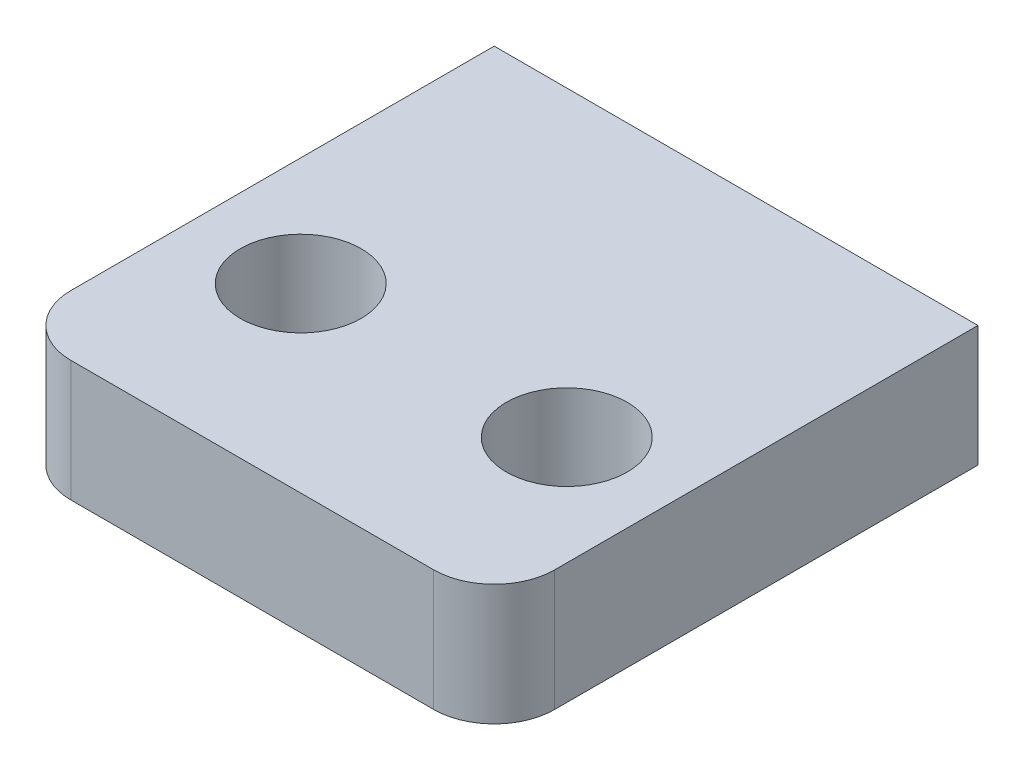
ISO-10303-21;
HEADER;
FILE_DESCRIPTION(('STEP AP214'),'2;1');
FILE_NAME('part.step','',(''),(''),'','','');
FILE_SCHEMA(('AUTOMOTIVE_DESIGN { 1 0 10303 214 1 1 1 1 }'));
ENDSEC;
DATA;
#1=APPLICATION_CONTEXT('core data for automotive mechanical design processes');
#2=APPLICATION_PROTOCOL_DEFINITION('international standard','automotive_design',2000,#1);
#3=PRODUCT_CONTEXT('',#1,'mechanical');
#4=PRODUCT('Part','Part','',(#3));
#5=PRODUCT_RELATED_PRODUCT_CATEGORY('part','',(#4));
#6=PRODUCT_DEFINITION_FORMATION('','',#4);
#7=PRODUCT_DEFINITION_CONTEXT('part definition',#1,'design');
#8=PRODUCT_DEFINITION('design','',#6,#7);
#9=PRODUCT_DEFINITION_SHAPE('','',#8);
#10=(LENGTH_UNIT() NAMED_UNIT(*) SI_UNIT(.MILLI.,.METRE.));
#11=(NAMED_UNIT(*) PLANE_ANGLE_UNIT() SI_UNIT($,.RADIAN.));
#12=(NAMED_UNIT(*) SI_UNIT($,.STERADIAN.) SOLID_ANGLE_UNIT());
#13=UNCERTAINTY_MEASURE_WITH_UNIT(LENGTH_MEASURE(1.E-05),#10,'distance_accuracy_value','');
#14=(GEOMETRIC_REPRESENTATION_CONTEXT(3) GLOBAL_UNCERTAINTY_ASSIGNED_CONTEXT((#13)) GLOBAL_UNIT_ASSIGNED_CONTEXT((#10,
#11,#12)) REPRESENTATION_CONTEXT('',''));
#15=CARTESIAN_POINT('',(0.,0.,0.));
#16=DIRECTION('',(0.,0.,1.));
#17=DIRECTION('',(1.,0.,0.));
#18=AXIS2_PLACEMENT_3D('',#15,#16,#17);
#19=CARTESIAN_POINT('',(0.,20.,0.));
#20=DIRECTION('',(0.,1.,0.));
#21=DIRECTION('',(0.,0.,1.));
#22=AXIS2_PLACEMENT_3D('',#19,#20,#21);
#23=PLANE('',#22);
#24=CARTESIAN_POINT('',(-2.62395543175487,20.,10.7799442896936));
#25=DIRECTION('',(0.,-1.,0.));
#26=DIRECTION('',(0.,0.,-1.));
#27=AXIS2_PLACEMENT_3D('',#24,#25,#26);
#28=CIRCLE('',#27,10.);
#29=CARTESIAN_POINT('',(-2.62395543175487,20.,0.779944289693604));
#30=VERTEX_POINT('',#29);
#31=EDGE_CURVE('E180',#30,#30,#28,.T.);
#32=ORIENTED_EDGE('',*,*,#31,.T.);
#33=EDGE_LOOP('',(#32));
#34=FACE_BOUND('',#33,.T.);
#35=DIRECTION('',(0.,0.,1.));
#36=VECTOR('',#35,1.);
#37=CARTESIAN_POINT('',(-64.6239554317549,20.,-39.2200557103064));
#38=LINE('',#37,#36);
#39=CARTESIAN_POINT('',(-64.6239554317549,20.,-39.2200557103064));
#40=VERTEX_POINT('',#39);
#41=CARTESIAN_POINT('',(-64.6239554317549,20.,30.7799442896936));
#42=VERTEX_POINT('',#41);
#43=EDGE_CURVE('E125',#40,#42,#38,.T.);
#44=ORIENTED_EDGE('',*,*,#43,.T.);
#45=CARTESIAN_POINT('',(-54.6239554317549,20.,30.7799442896936));
#46=DIRECTION('',(0.,1.,0.));
#47=DIRECTION('',(0.,0.,1.));
#48=AXIS2_PLACEMENT_3D('',#45,#46,#47);
#49=CIRCLE('',#48,10.);
#50=CARTESIAN_POINT('',(-54.6239554317549,20.,40.7799442896936));
#51=VERTEX_POINT('',#50);
#52=EDGE_CURVE('E11',#42,#51,#49,.T.);
#53=ORIENTED_EDGE('',*,*,#52,.T.);
#54=DIRECTION('',(1.,0.,0.));
#55=VECTOR('',#54,1.);
#56=CARTESIAN_POINT('',(-64.6239554317549,20.,40.7799442896936));
#57=LINE('',#56,#55);
#58=CARTESIAN_POINT('',(5.37604456824514,20.,40.7799442896936));
#59=VERTEX_POINT('',#58);
#60=EDGE_CURVE('E100',#51,#59,#57,.T.);
#61=ORIENTED_EDGE('',*,*,#60,.T.);
#62=CARTESIAN_POINT('',(5.37604456824514,20.,30.7799442896936));
#63=DIRECTION('',(0.,1.,0.));
#64=DIRECTION('',(0.,0.,1.));
#65=AXIS2_PLACEMENT_3D('',#62,#63,#64);
#66=CIRCLE('',#65,10.);
#67=CARTESIAN_POINT('',(15.3760445682451,20.,30.7799442896936));
#68=VERTEX_POINT('',#67);
#69=EDGE_CURVE('E96',#59,#68,#66,.T.);
#70=ORIENTED_EDGE('',*,*,#69,.T.);
#71=DIRECTION('',(0.,0.,-1.));
#72=VECTOR('',#71,1.);
#73=CARTESIAN_POINT('',(15.3760445682451,20.,-39.2200557103064));
#74=LINE('',#73,#72);
#75=CARTESIAN_POINT('',(15.3760445682451,20.,-39.2200557103064));
#76=VERTEX_POINT('',#75);
#77=EDGE_CURVE('E89',#68,#76,#74,.T.);
#78=ORIENTED_EDGE('',*,*,#77,.T.);
#79=DIRECTION('',(-1.,0.,0.));
#80=VECTOR('',#79,1.);
#81=CARTESIAN_POINT('',(-64.6239554317549,20.,-39.2200557103064));
#82=LINE('',#81,#80);
#83=EDGE_CURVE('E93',#76,#40,#82,.T.);
#84=ORIENTED_EDGE('',*,*,#83,.T.);
#85=EDGE_LOOP('',(#44,#53,#61,#70,#78,#84));
#86=FACE_BOUND('',#85,.T.);
#87=CARTESIAN_POINT('',(-46.6239554317549,20.,10.7799442896936));
#88=DIRECTION('',(0.,1.,0.));
#89=DIRECTION('',(0.,0.,1.));
#90=AXIS2_PLACEMENT_3D('',#87,#88,#89);
#91=CIRCLE('',#90,10.);
#92=CARTESIAN_POINT('',(-46.6239554317549,20.,20.7799442896936));
#93=VERTEX_POINT('',#92);
#94=EDGE_CURVE('E182',#93,#93,#91,.T.);
#95=ORIENTED_EDGE('',*,*,#94,.F.);
#96=EDGE_LOOP('',(#95));
#97=FACE_BOUND('',#96,.T.);
#98=ADVANCED_FACE('F37',(#34,#86,#97),#23,.T.);
#99=CARTESIAN_POINT('',(0.,0.,0.));
#100=DIRECTION('',(0.,1.,0.));
#101=DIRECTION('',(0.,0.,1.));
#102=AXIS2_PLACEMENT_3D('',#99,#100,#101);
#103=PLANE('',#102);
#104=DIRECTION('',(1.,0.,0.));
#105=VECTOR('',#104,1.);
#106=CARTESIAN_POINT('',(-64.6239554317549,0.,40.7799442896936));
#107=LINE('',#106,#105);
#108=CARTESIAN_POINT('',(-54.6239554317549,0.,40.7799442896936));
#109=VERTEX_POINT('',#108);
#110=CARTESIAN_POINT('',(5.37604456824514,0.,40.7799442896936));
#111=VERTEX_POINT('',#110);
#112=EDGE_CURVE('E120',#109,#111,#107,.T.);
#113=ORIENTED_EDGE('',*,*,#112,.F.);
#114=CARTESIAN_POINT('',(-54.6239554317549,0.,30.7799442896936));
#115=DIRECTION('',(0.,1.,0.));
#116=DIRECTION('',(0.,0.,1.));
#117=AXIS2_PLACEMENT_3D('',#114,#115,#116);
#118=CIRCLE('',#117,10.);
#119=CARTESIAN_POINT('',(-64.6239554317549,0.,30.7799442896936));
#120=VERTEX_POINT('',#119);
#121=EDGE_CURVE('E59',#109,#120,#118,.F.);
#122=ORIENTED_EDGE('',*,*,#121,.T.);
#123=DIRECTION('',(0.,0.,1.));
#124=VECTOR('',#123,1.);
#125=CARTESIAN_POINT('',(-64.6239554317549,0.,-39.2200557103064));
#126=LINE('',#125,#124);
#127=CARTESIAN_POINT('',(-64.6239554317549,0.,-39.2200557103064));
#128=VERTEX_POINT('',#127);
#129=EDGE_CURVE('E118',#128,#120,#126,.T.);
#130=ORIENTED_EDGE('',*,*,#129,.F.);
#131=DIRECTION('',(-1.,0.,0.));
#132=VECTOR('',#131,1.);
#133=CARTESIAN_POINT('',(-64.6239554317549,0.,-39.2200557103064));
#134=LINE('',#133,#132);
#135=CARTESIAN_POINT('',(15.3760445682451,0.,-39.2200557103064));
#136=VERTEX_POINT('',#135);
#137=EDGE_CURVE('E124',#136,#128,#134,.T.);
#138=ORIENTED_EDGE('',*,*,#137,.F.);
#139=DIRECTION('',(0.,0.,-1.));
#140=VECTOR('',#139,1.);
#141=CARTESIAN_POINT('',(15.3760445682451,0.,-39.2200557103064));
#142=LINE('',#141,#140);
#143=CARTESIAN_POINT('',(15.3760445682451,0.,30.7799442896936));
#144=VERTEX_POINT('',#143);
#145=EDGE_CURVE('E106',#144,#136,#142,.T.);
#146=ORIENTED_EDGE('',*,*,#145,.F.);
#147=CARTESIAN_POINT('',(5.37604456824514,0.,30.7799442896936));
#148=DIRECTION('',(0.,1.,0.));
#149=DIRECTION('',(0.,0.,1.));
#150=AXIS2_PLACEMENT_3D('',#147,#148,#149);
#151=CIRCLE('',#150,10.);
#152=EDGE_CURVE('E128',#144,#111,#151,.F.);
#153=ORIENTED_EDGE('',*,*,#152,.T.);
#154=EDGE_LOOP('',(#113,#122,#130,#138,#146,#153));
#155=FACE_BOUND('',#154,.T.);
#156=CARTESIAN_POINT('',(-2.62395543175487,0.,10.7799442896936));
#157=DIRECTION('',(0.,-1.,0.));
#158=DIRECTION('',(0.,0.,-1.));
#159=AXIS2_PLACEMENT_3D('',#156,#157,#158);
#160=CIRCLE('',#159,10.);
#161=CARTESIAN_POINT('',(-2.62395543175487,0.,0.779944289693604));
#162=VERTEX_POINT('',#161);
#163=EDGE_CURVE('E177',#162,#162,#160,.T.);
#164=ORIENTED_EDGE('',*,*,#163,.F.);
#165=EDGE_LOOP('',(#164));
#166=FACE_BOUND('',#165,.T.);
#167=CARTESIAN_POINT('',(-46.6239554317549,0.,10.7799442896936));
#168=DIRECTION('',(0.,1.,0.));
#169=DIRECTION('',(0.,0.,1.));
#170=AXIS2_PLACEMENT_3D('',#167,#168,#169);
#171=CIRCLE('',#170,10.);
#172=CARTESIAN_POINT('',(-46.6239554317549,0.,20.7799442896936));
#173=VERTEX_POINT('',#172);
#174=EDGE_CURVE('E121',#173,#173,#171,.T.);
#175=ORIENTED_EDGE('',*,*,#174,.T.);
#176=EDGE_LOOP('',(#175));
#177=FACE_BOUND('',#176,.T.);
#178=ADVANCED_FACE('F144',(#155,#166,#177),#103,.F.);
#179=CARTESIAN_POINT('',(-64.6239554317549,20.,-39.2200557103064));
#180=DIRECTION('',(1.,0.,0.));
#181=DIRECTION('',(0.,0.,-1.));
#182=AXIS2_PLACEMENT_3D('',#179,#180,#181);
#183=PLANE('',#182);
#184=ORIENTED_EDGE('',*,*,#129,.T.);
#185=DIRECTION('',(0.,-1.,0.));
#186=VECTOR('',#185,1.);
#187=CARTESIAN_POINT('',(-64.6239554317549,20.,30.7799442896936));
#188=LINE('',#187,#186);
#189=EDGE_CURVE('E45',#120,#42,#188,.F.);
#190=ORIENTED_EDGE('',*,*,#189,.T.);
#191=ORIENTED_EDGE('',*,*,#43,.F.);
#192=DIRECTION('',(0.,-1.,0.));
#193=VECTOR('',#192,1.);
#194=CARTESIAN_POINT('',(-64.6239554317549,20.,-39.2200557103064));
#195=LINE('',#194,#193);
#196=EDGE_CURVE('E110',#40,#128,#195,.T.);
#197=ORIENTED_EDGE('',*,*,#196,.T.);
#198=EDGE_LOOP('',(#184,#190,#191,#197));
#199=FACE_BOUND('',#198,.T.);
#200=ADVANCED_FACE('F163',(#199),#183,.F.);
#201=CARTESIAN_POINT('',(-64.6239554317549,20.,40.7799442896936));
#202=DIRECTION('',(0.,0.,-1.));
#203=DIRECTION('',(-1.,0.,0.));
#204=AXIS2_PLACEMENT_3D('',#201,#202,#203);
#205=PLANE('',#204);
#206=ORIENTED_EDGE('',*,*,#60,.F.);
#207=DIRECTION('',(0.,-1.,0.));
#208=VECTOR('',#207,1.);
#209=CARTESIAN_POINT('',(-54.6239554317549,20.,40.7799442896936));
#210=LINE('',#209,#208);
#211=EDGE_CURVE('E135',#51,#109,#210,.T.);
#212=ORIENTED_EDGE('',*,*,#211,.T.);
#213=ORIENTED_EDGE('',*,*,#112,.T.);
#214=DIRECTION('',(0.,-1.,0.));
#215=VECTOR('',#214,1.);
#216=CARTESIAN_POINT('',(5.37604456824514,20.,40.7799442896936));
#217=LINE('',#216,#215);
#218=EDGE_CURVE('E131',#111,#59,#217,.F.);
#219=ORIENTED_EDGE('',*,*,#218,.T.);
#220=EDGE_LOOP('',(#206,#212,#213,#219));
#221=FACE_BOUND('',#220,.T.);
#222=ADVANCED_FACE('F141',(#221),#205,.F.);
#223=CARTESIAN_POINT('',(15.3760445682451,20.,-39.2200557103064));
#224=DIRECTION('',(-1.,0.,0.));
#225=DIRECTION('',(0.,0.,1.));
#226=AXIS2_PLACEMENT_3D('',#223,#224,#225);
#227=PLANE('',#226);
#228=ORIENTED_EDGE('',*,*,#77,.F.);
#229=DIRECTION('',(0.,-1.,0.));
#230=VECTOR('',#229,1.);
#231=CARTESIAN_POINT('',(15.3760445682451,20.,30.7799442896936));
#232=LINE('',#231,#230);
#233=EDGE_CURVE('E109',#68,#144,#232,.T.);
#234=ORIENTED_EDGE('',*,*,#233,.T.);
#235=ORIENTED_EDGE('',*,*,#145,.T.);
#236=DIRECTION('',(0.,-1.,0.));
#237=VECTOR('',#236,1.);
#238=CARTESIAN_POINT('',(15.3760445682451,20.,-39.2200557103064));
#239=LINE('',#238,#237);
#240=EDGE_CURVE('E103',#76,#136,#239,.T.);
#241=ORIENTED_EDGE('',*,*,#240,.F.);
#242=EDGE_LOOP('',(#228,#234,#235,#241));
#243=FACE_BOUND('',#242,.T.);
#244=ADVANCED_FACE('F104',(#243),#227,.F.);
#245=CARTESIAN_POINT('',(-64.6239554317549,20.,-39.2200557103064));
#246=DIRECTION('',(0.,0.,1.));
#247=DIRECTION('',(1.,0.,0.));
#248=AXIS2_PLACEMENT_3D('',#245,#246,#247);
#249=PLANE('',#248);
#250=ORIENTED_EDGE('',*,*,#137,.T.);
#251=ORIENTED_EDGE('',*,*,#196,.F.);
#252=ORIENTED_EDGE('',*,*,#83,.F.);
#253=ORIENTED_EDGE('',*,*,#240,.T.);
#254=EDGE_LOOP('',(#250,#251,#252,#253));
#255=FACE_BOUND('',#254,.T.);
#256=ADVANCED_FACE('F112',(#255),#249,.F.);
#257=CARTESIAN_POINT('',(5.37604456824514,20.,30.7799442896936));
#258=DIRECTION('',(0.,-1.,0.));
#259=DIRECTION('',(0.,0.,-1.));
#260=AXIS2_PLACEMENT_3D('',#257,#258,#259);
#261=CYLINDRICAL_SURFACE('',#260,10.);
#262=ORIENTED_EDGE('',*,*,#69,.F.);
#263=ORIENTED_EDGE('',*,*,#218,.F.);
#264=ORIENTED_EDGE('',*,*,#152,.F.);
#265=ORIENTED_EDGE('',*,*,#233,.F.);
#266=EDGE_LOOP('',(#262,#263,#264,#265));
#267=FACE_BOUND('',#266,.T.);
#268=ADVANCED_FACE('F148',(#267),#261,.T.);
#269=CARTESIAN_POINT('',(-54.6239554317549,20.,30.7799442896936));
#270=DIRECTION('',(0.,-1.,0.));
#271=DIRECTION('',(0.,0.,-1.));
#272=AXIS2_PLACEMENT_3D('',#269,#270,#271);
#273=CYLINDRICAL_SURFACE('',#272,10.);
#274=ORIENTED_EDGE('',*,*,#52,.F.);
#275=ORIENTED_EDGE('',*,*,#189,.F.);
#276=ORIENTED_EDGE('',*,*,#121,.F.);
#277=ORIENTED_EDGE('',*,*,#211,.F.);
#278=EDGE_LOOP('',(#274,#275,#276,#277));
#279=FACE_BOUND('',#278,.T.);
#280=ADVANCED_FACE('F39',(#279),#273,.T.);
#281=CARTESIAN_POINT('',(-2.62395543175487,0.,10.7799442896936));
#282=DIRECTION('',(0.,1.,0.));
#283=DIRECTION('',(0.,0.,1.));
#284=AXIS2_PLACEMENT_3D('',#281,#282,#283);
#285=CYLINDRICAL_SURFACE('',#284,10.);
#286=ORIENTED_EDGE('',*,*,#163,.T.);
#287=EDGE_LOOP('',(#286));
#288=FACE_BOUND('',#287,.T.);
#289=ORIENTED_EDGE('',*,*,#31,.F.);
#290=EDGE_LOOP('',(#289));
#291=FACE_BOUND('',#290,.T.);
#292=ADVANCED_FACE('F154',(#288,#291),#285,.F.);
#293=CARTESIAN_POINT('',(-46.6239554317549,0.,10.7799442896936));
#294=DIRECTION('',(0.,1.,0.));
#295=DIRECTION('',(0.,0.,1.));
#296=AXIS2_PLACEMENT_3D('',#293,#294,#295);
#297=CYLINDRICAL_SURFACE('',#296,10.);
#298=ORIENTED_EDGE('',*,*,#174,.F.);
#299=EDGE_LOOP('',(#298));
#300=FACE_BOUND('',#299,.T.);
#301=ORIENTED_EDGE('',*,*,#94,.T.);
#302=EDGE_LOOP('',(#301));
#303=FACE_BOUND('',#302,.T.);
#304=ADVANCED_FACE('F189',(#300,#303),#297,.F.);
#305=CLOSED_SHELL('',(#98,#178,#200,#222,#244,#256,#268,#280,#292,#304));
#306=MANIFOLD_SOLID_BREP('B2',#305);
#307=ADVANCED_BREP_SHAPE_REPRESENTATION('',(#18,#306),#14);
#308=SHAPE_DEFINITION_REPRESENTATION(#9,#307);
ENDSEC;
END-ISO-10303-21;
